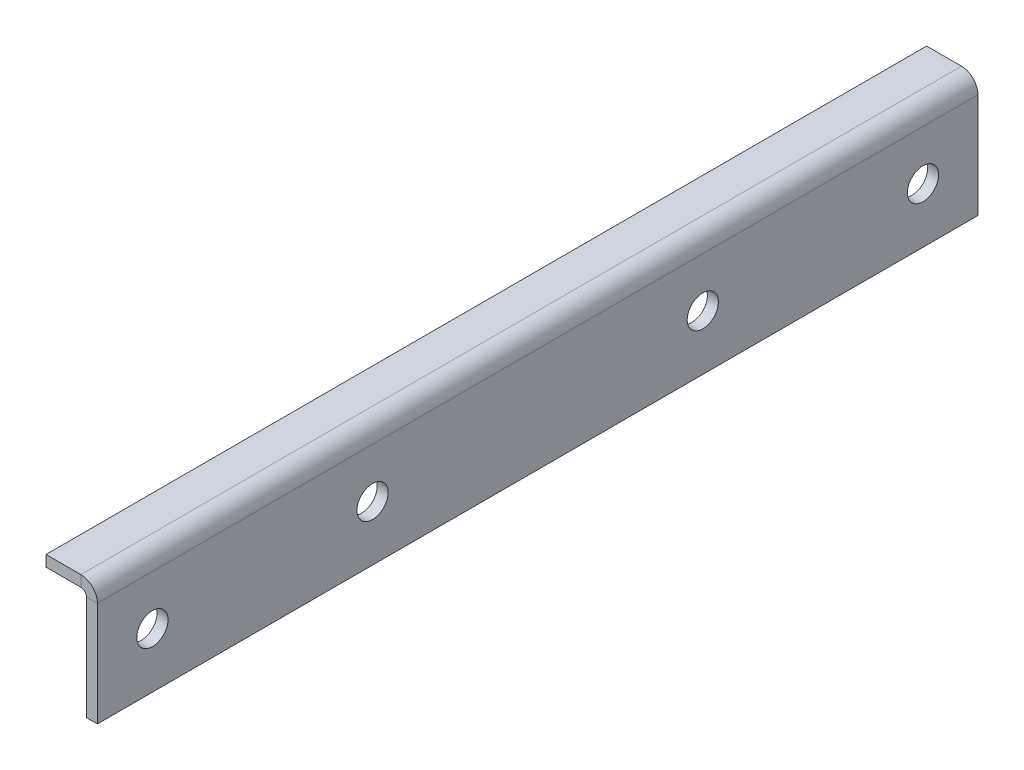
ISO-10303-21;
HEADER;
FILE_DESCRIPTION(('STEP AP214'),'2;1');
FILE_NAME('part.step','',(''),(''),'','','');
FILE_SCHEMA(('AUTOMOTIVE_DESIGN { 1 0 10303 214 1 1 1 1 }'));
ENDSEC;
DATA;
#1=APPLICATION_CONTEXT('core data for automotive mechanical design processes');
#2=APPLICATION_PROTOCOL_DEFINITION('international standard','automotive_design',2000,#1);
#3=PRODUCT_CONTEXT('',#1,'mechanical');
#4=PRODUCT('Part','Part','',(#3));
#5=PRODUCT_RELATED_PRODUCT_CATEGORY('part','',(#4));
#6=PRODUCT_DEFINITION_FORMATION('','',#4);
#7=PRODUCT_DEFINITION_CONTEXT('part definition',#1,'design');
#8=PRODUCT_DEFINITION('design','',#6,#7);
#9=PRODUCT_DEFINITION_SHAPE('','',#8);
#10=(LENGTH_UNIT() NAMED_UNIT(*) SI_UNIT(.MILLI.,.METRE.));
#11=(NAMED_UNIT(*) PLANE_ANGLE_UNIT() SI_UNIT($,.RADIAN.));
#12=(NAMED_UNIT(*) SI_UNIT($,.STERADIAN.) SOLID_ANGLE_UNIT());
#13=UNCERTAINTY_MEASURE_WITH_UNIT(LENGTH_MEASURE(1.E-05),#10,'distance_accuracy_value','');
#14=(GEOMETRIC_REPRESENTATION_CONTEXT(3) GLOBAL_UNCERTAINTY_ASSIGNED_CONTEXT((#13)) GLOBAL_UNIT_ASSIGNED_CONTEXT((#10,
#11,#12)) REPRESENTATION_CONTEXT('',''));
#15=CARTESIAN_POINT('',(0.,0.,0.));
#16=DIRECTION('',(0.,0.,1.));
#17=DIRECTION('',(1.,0.,0.));
#18=AXIS2_PLACEMENT_3D('',#15,#16,#17);
#19=CARTESIAN_POINT('',(3.00000000000005,-30.,-270.149626863363));
#20=DIRECTION('',(1.,0.,0.));
#21=DIRECTION('',(0.,1.,0.));
#22=AXIS2_PLACEMENT_3D('',#19,#20,#21);
#23=PLANE('',#22);
#24=CARTESIAN_POINT('',(3.00000000000002,-15.,-225.));
#25=DIRECTION('',(1.,0.,0.));
#26=DIRECTION('',(0.,1.,0.));
#27=AXIS2_PLACEMENT_3D('',#24,#25,#26);
#28=CIRCLE('',#27,4.25000000000001);
#29=CARTESIAN_POINT('',(3.00000000000002,-10.75,-225.));
#30=VERTEX_POINT('',#29);
#31=EDGE_CURVE('E171',#30,#30,#28,.T.);
#32=ORIENTED_EDGE('',*,*,#31,.F.);
#33=EDGE_LOOP('',(#32));
#34=FACE_BOUND('',#33,.T.);
#35=CARTESIAN_POINT('',(3.00000000000002,-15.,-165.));
#36=DIRECTION('',(1.,0.,0.));
#37=DIRECTION('',(0.,1.,0.));
#38=AXIS2_PLACEMENT_3D('',#35,#36,#37);
#39=CIRCLE('',#38,4.25000000000001);
#40=CARTESIAN_POINT('',(3.00000000000002,-10.75,-165.));
#41=VERTEX_POINT('',#40);
#42=EDGE_CURVE('E177',#41,#41,#39,.T.);
#43=ORIENTED_EDGE('',*,*,#42,.F.);
#44=EDGE_LOOP('',(#43));
#45=FACE_BOUND('',#44,.T.);
#46=CARTESIAN_POINT('',(3.00000000000002,-15.,-74.9999999999998));
#47=DIRECTION('',(1.,0.,0.));
#48=DIRECTION('',(0.,1.,0.));
#49=AXIS2_PLACEMENT_3D('',#46,#47,#48);
#50=CIRCLE('',#49,4.25000000000001);
#51=CARTESIAN_POINT('',(3.00000000000002,-10.75,-74.9999999999998));
#52=VERTEX_POINT('',#51);
#53=EDGE_CURVE('E183',#52,#52,#50,.T.);
#54=ORIENTED_EDGE('',*,*,#53,.F.);
#55=EDGE_LOOP('',(#54));
#56=FACE_BOUND('',#55,.T.);
#57=CARTESIAN_POINT('',(3.00000000000002,-15.,-15.));
#58=DIRECTION('',(1.,0.,0.));
#59=DIRECTION('',(0.,1.,0.));
#60=AXIS2_PLACEMENT_3D('',#57,#58,#59);
#61=CIRCLE('',#60,4.25000000000001);
#62=CARTESIAN_POINT('',(3.00000000000002,-10.75,-15.));
#63=VERTEX_POINT('',#62);
#64=EDGE_CURVE('E165',#63,#63,#61,.T.);
#65=ORIENTED_EDGE('',*,*,#64,.F.);
#66=EDGE_LOOP('',(#65));
#67=FACE_BOUND('',#66,.T.);
#68=DIRECTION('',(0.,1.,0.));
#69=VECTOR('',#68,1.);
#70=CARTESIAN_POINT('',(3.00000000000005,-30.,-240.));
#71=LINE('',#70,#69);
#72=CARTESIAN_POINT('',(3.00000000000005,-30.,-240.));
#73=VERTEX_POINT('',#72);
#74=CARTESIAN_POINT('',(3.00000000000001,-1.50000000000001,-240.));
#75=VERTEX_POINT('',#74);
#76=EDGE_CURVE('E170',#73,#75,#71,.T.);
#77=ORIENTED_EDGE('',*,*,#76,.T.);
#78=DIRECTION('',(0.,0.,-1.));
#79=VECTOR('',#78,1.);
#80=CARTESIAN_POINT('',(3.00000000000001,-1.50000000000001,-240.));
#81=LINE('',#80,#79);
#82=CARTESIAN_POINT('',(3.00000000000002,-1.50000000000001,0.));
#83=VERTEX_POINT('',#82);
#84=EDGE_CURVE('E108',#75,#83,#81,.F.);
#85=ORIENTED_EDGE('',*,*,#84,.T.);
#86=DIRECTION('',(0.,1.,0.));
#87=VECTOR('',#86,1.);
#88=CARTESIAN_POINT('',(3.00000000000005,-30.,0.));
#89=LINE('',#88,#87);
#90=CARTESIAN_POINT('',(3.00000000000005,-30.,0.));
#91=VERTEX_POINT('',#90);
#92=EDGE_CURVE('E198',#91,#83,#89,.T.);
#93=ORIENTED_EDGE('',*,*,#92,.F.);
#94=DIRECTION('',(0.,0.,1.));
#95=VECTOR('',#94,1.);
#96=CARTESIAN_POINT('',(3.00000000000005,-30.,-270.149626863363));
#97=LINE('',#96,#95);
#98=EDGE_CURVE('E11',#73,#91,#97,.T.);
#99=ORIENTED_EDGE('',*,*,#98,.F.);
#100=EDGE_LOOP('',(#77,#85,#93,#99));
#101=FACE_BOUND('',#100,.T.);
#102=ADVANCED_FACE('F38',(#34,#45,#56,#67,#101),#23,.T.);
#103=CARTESIAN_POINT('',(0.,-30.,-270.149626863363));
#104=DIRECTION('',(1.,0.,0.));
#105=DIRECTION('',(0.,1.,0.));
#106=AXIS2_PLACEMENT_3D('',#103,#104,#105);
#107=PLANE('',#106);
#108=CARTESIAN_POINT('',(0.,-15.,-15.));
#109=DIRECTION('',(1.,0.,0.));
#110=DIRECTION('',(0.,1.,0.));
#111=AXIS2_PLACEMENT_3D('',#108,#109,#110);
#112=CIRCLE('',#111,4.25000000000001);
#113=CARTESIAN_POINT('',(0.,-10.75,-15.));
#114=VERTEX_POINT('',#113);
#115=EDGE_CURVE('E186',#114,#114,#112,.T.);
#116=ORIENTED_EDGE('',*,*,#115,.T.);
#117=EDGE_LOOP('',(#116));
#118=FACE_BOUND('',#117,.T.);
#119=CARTESIAN_POINT('',(0.,-15.,-74.9999999999998));
#120=DIRECTION('',(1.,0.,0.));
#121=DIRECTION('',(0.,1.,0.));
#122=AXIS2_PLACEMENT_3D('',#119,#120,#121);
#123=CIRCLE('',#122,4.25000000000001);
#124=CARTESIAN_POINT('',(0.,-10.75,-74.9999999999998));
#125=VERTEX_POINT('',#124);
#126=EDGE_CURVE('E180',#125,#125,#123,.T.);
#127=ORIENTED_EDGE('',*,*,#126,.T.);
#128=EDGE_LOOP('',(#127));
#129=FACE_BOUND('',#128,.T.);
#130=CARTESIAN_POINT('',(0.,-15.,-165.));
#131=DIRECTION('',(1.,0.,0.));
#132=DIRECTION('',(0.,1.,0.));
#133=AXIS2_PLACEMENT_3D('',#130,#131,#132);
#134=CIRCLE('',#133,4.25000000000001);
#135=CARTESIAN_POINT('',(0.,-10.75,-165.));
#136=VERTEX_POINT('',#135);
#137=EDGE_CURVE('E174',#136,#136,#134,.T.);
#138=ORIENTED_EDGE('',*,*,#137,.T.);
#139=EDGE_LOOP('',(#138));
#140=FACE_BOUND('',#139,.T.);
#141=CARTESIAN_POINT('',(0.,-15.,-225.));
#142=DIRECTION('',(1.,0.,0.));
#143=DIRECTION('',(0.,1.,0.));
#144=AXIS2_PLACEMENT_3D('',#141,#142,#143);
#145=CIRCLE('',#144,4.25000000000001);
#146=CARTESIAN_POINT('',(0.,-10.75,-225.));
#147=VERTEX_POINT('',#146);
#148=EDGE_CURVE('E167',#147,#147,#145,.T.);
#149=ORIENTED_EDGE('',*,*,#148,.T.);
#150=EDGE_LOOP('',(#149));
#151=FACE_BOUND('',#150,.T.);
#152=DIRECTION('',(0.,0.,-1.));
#153=VECTOR('',#152,1.);
#154=CARTESIAN_POINT('',(0.,-1.49999999999999,-240.));
#155=LINE('',#154,#153);
#156=CARTESIAN_POINT('',(0.,-1.49999999999999,-240.));
#157=VERTEX_POINT('',#156);
#158=CARTESIAN_POINT('',(0.,-1.50000000000001,0.));
#159=VERTEX_POINT('',#158);
#160=EDGE_CURVE('E159',#157,#159,#155,.F.);
#161=ORIENTED_EDGE('',*,*,#160,.F.);
#162=DIRECTION('',(0.,1.,0.));
#163=VECTOR('',#162,1.);
#164=CARTESIAN_POINT('',(0.,-30.,-240.));
#165=LINE('',#164,#163);
#166=CARTESIAN_POINT('',(0.,-30.,-240.));
#167=VERTEX_POINT('',#166);
#168=EDGE_CURVE('E191',#167,#157,#165,.T.);
#169=ORIENTED_EDGE('',*,*,#168,.F.);
#170=DIRECTION('',(0.,0.,1.));
#171=VECTOR('',#170,1.);
#172=CARTESIAN_POINT('',(0.,-30.,-270.149626863363));
#173=LINE('',#172,#171);
#174=CARTESIAN_POINT('',(0.,-30.,0.));
#175=VERTEX_POINT('',#174);
#176=EDGE_CURVE('E41',#167,#175,#173,.T.);
#177=ORIENTED_EDGE('',*,*,#176,.T.);
#178=DIRECTION('',(0.,1.,0.));
#179=VECTOR('',#178,1.);
#180=CARTESIAN_POINT('',(0.,-30.,0.));
#181=LINE('',#180,#179);
#182=EDGE_CURVE('E201',#175,#159,#181,.T.);
#183=ORIENTED_EDGE('',*,*,#182,.T.);
#184=EDGE_LOOP('',(#161,#169,#177,#183));
#185=FACE_BOUND('',#184,.T.);
#186=ADVANCED_FACE('F211',(#118,#129,#140,#151,#185),#107,.F.);
#187=CARTESIAN_POINT('',(0.,0.,0.));
#188=DIRECTION('',(0.,0.,-1.));
#189=DIRECTION('',(-1.,0.,0.));
#190=AXIS2_PLACEMENT_3D('',#187,#188,#189);
#191=PLANE('',#190);
#192=DIRECTION('',(1.,0.,0.));
#193=VECTOR('',#192,1.);
#194=CARTESIAN_POINT('',(0.,-1.50000000000001,0.));
#195=LINE('',#194,#193);
#196=EDGE_CURVE('E162',#159,#83,#195,.T.);
#197=ORIENTED_EDGE('',*,*,#196,.F.);
#198=ORIENTED_EDGE('',*,*,#182,.F.);
#199=DIRECTION('',(-1.,0.,0.));
#200=VECTOR('',#199,1.);
#201=CARTESIAN_POINT('',(3.00000000000005,-30.,0.));
#202=LINE('',#201,#200);
#203=EDGE_CURVE('E203',#91,#175,#202,.T.);
#204=ORIENTED_EDGE('',*,*,#203,.F.);
#205=ORIENTED_EDGE('',*,*,#92,.T.);
#206=EDGE_LOOP('',(#197,#198,#204,#205));
#207=FACE_BOUND('',#206,.T.);
#208=ADVANCED_FACE('F209',(#207),#191,.F.);
#209=CARTESIAN_POINT('',(3.00000000000005,-30.,-240.));
#210=DIRECTION('',(0.,0.,-1.));
#211=DIRECTION('',(0.,1.,0.));
#212=AXIS2_PLACEMENT_3D('',#209,#210,#211);
#213=PLANE('',#212);
#214=ORIENTED_EDGE('',*,*,#168,.T.);
#215=DIRECTION('',(1.,0.,0.));
#216=VECTOR('',#215,1.);
#217=CARTESIAN_POINT('',(0.,-1.49999999999999,-240.));
#218=LINE('',#217,#216);
#219=EDGE_CURVE('E155',#157,#75,#218,.T.);
#220=ORIENTED_EDGE('',*,*,#219,.T.);
#221=ORIENTED_EDGE('',*,*,#76,.F.);
#222=DIRECTION('',(1.,0.,0.));
#223=VECTOR('',#222,1.);
#224=CARTESIAN_POINT('',(3.00000000000005,-30.,-240.));
#225=LINE('',#224,#223);
#226=EDGE_CURVE('E194',#73,#167,#225,.F.);
#227=ORIENTED_EDGE('',*,*,#226,.T.);
#228=EDGE_LOOP('',(#214,#220,#221,#227));
#229=FACE_BOUND('',#228,.T.);
#230=ADVANCED_FACE('F215',(#229),#213,.T.);
#231=CARTESIAN_POINT('',(3.00000000000005,-30.,-270.149626863363));
#232=DIRECTION('',(0.,1.,0.));
#233=DIRECTION('',(-1.,0.,0.));
#234=AXIS2_PLACEMENT_3D('',#231,#232,#233);
#235=PLANE('',#234);
#236=ORIENTED_EDGE('',*,*,#226,.F.);
#237=ORIENTED_EDGE('',*,*,#98,.T.);
#238=ORIENTED_EDGE('',*,*,#203,.T.);
#239=ORIENTED_EDGE('',*,*,#176,.F.);
#240=EDGE_LOOP('',(#236,#237,#238,#239));
#241=FACE_BOUND('',#240,.T.);
#242=ADVANCED_FACE('F205',(#241),#235,.F.);
#243=CARTESIAN_POINT('',(0.,-15.,-15.));
#244=DIRECTION('',(1.,0.,0.));
#245=DIRECTION('',(0.,1.,0.));
#246=AXIS2_PLACEMENT_3D('',#243,#244,#245);
#247=CYLINDRICAL_SURFACE('',#246,4.25000000000001);
#248=ORIENTED_EDGE('',*,*,#115,.F.);
#249=EDGE_LOOP('',(#248));
#250=FACE_BOUND('',#249,.T.);
#251=ORIENTED_EDGE('',*,*,#64,.T.);
#252=EDGE_LOOP('',(#251));
#253=FACE_BOUND('',#252,.T.);
#254=ADVANCED_FACE('F231',(#250,#253),#247,.F.);
#255=CARTESIAN_POINT('',(0.,-15.,-74.9999999999998));
#256=DIRECTION('',(1.,0.,0.));
#257=DIRECTION('',(0.,1.,0.));
#258=AXIS2_PLACEMENT_3D('',#255,#256,#257);
#259=CYLINDRICAL_SURFACE('',#258,4.25000000000001);
#260=ORIENTED_EDGE('',*,*,#126,.F.);
#261=EDGE_LOOP('',(#260));
#262=FACE_BOUND('',#261,.T.);
#263=ORIENTED_EDGE('',*,*,#53,.T.);
#264=EDGE_LOOP('',(#263));
#265=FACE_BOUND('',#264,.T.);
#266=ADVANCED_FACE('F233',(#262,#265),#259,.F.);
#267=CARTESIAN_POINT('',(0.,-15.,-165.));
#268=DIRECTION('',(1.,0.,0.));
#269=DIRECTION('',(0.,1.,0.));
#270=AXIS2_PLACEMENT_3D('',#267,#268,#269);
#271=CYLINDRICAL_SURFACE('',#270,4.25000000000001);
#272=ORIENTED_EDGE('',*,*,#137,.F.);
#273=EDGE_LOOP('',(#272));
#274=FACE_BOUND('',#273,.T.);
#275=ORIENTED_EDGE('',*,*,#42,.T.);
#276=EDGE_LOOP('',(#275));
#277=FACE_BOUND('',#276,.T.);
#278=ADVANCED_FACE('F240',(#274,#277),#271,.F.);
#279=CARTESIAN_POINT('',(0.,-15.,-225.));
#280=DIRECTION('',(1.,0.,0.));
#281=DIRECTION('',(0.,1.,0.));
#282=AXIS2_PLACEMENT_3D('',#279,#280,#281);
#283=CYLINDRICAL_SURFACE('',#282,4.25000000000001);
#284=ORIENTED_EDGE('',*,*,#148,.F.);
#285=EDGE_LOOP('',(#284));
#286=FACE_BOUND('',#285,.T.);
#287=ORIENTED_EDGE('',*,*,#31,.T.);
#288=EDGE_LOOP('',(#287));
#289=FACE_BOUND('',#288,.T.);
#290=ADVANCED_FACE('F285',(#286,#289),#283,.F.);
#291=CARTESIAN_POINT('',(-1.5,-1.5,0.));
#292=DIRECTION('',(0.,0.,1.));
#293=DIRECTION('',(0.,-1.,0.));
#294=AXIS2_PLACEMENT_3D('',#291,#292,#293);
#295=PLANE('',#294);
#296=DIRECTION('',(0.,1.,0.));
#297=VECTOR('',#296,1.);
#298=CARTESIAN_POINT('',(-1.49999999999999,0.,0.));
#299=LINE('',#298,#297);
#300=CARTESIAN_POINT('',(-1.49999999999999,0.,0.));
#301=VERTEX_POINT('',#300);
#302=CARTESIAN_POINT('',(-1.49999999999999,3.,0.));
#303=VERTEX_POINT('',#302);
#304=EDGE_CURVE('E428',#301,#303,#299,.T.);
#305=ORIENTED_EDGE('',*,*,#304,.F.);
#306=CARTESIAN_POINT('',(-1.5,-1.5,0.));
#307=DIRECTION('',(0.,0.,-1.));
#308=DIRECTION('',(0.,1.,0.));
#309=AXIS2_PLACEMENT_3D('',#306,#307,#308);
#310=CIRCLE('',#309,1.50000000000001);
#311=EDGE_CURVE('E111',#159,#301,#310,.F.);
#312=ORIENTED_EDGE('',*,*,#311,.F.);
#313=ORIENTED_EDGE('',*,*,#196,.T.);
#314=CARTESIAN_POINT('',(-1.5,-1.5,0.));
#315=DIRECTION('',(0.,0.,-1.));
#316=DIRECTION('',(0.,1.,0.));
#317=AXIS2_PLACEMENT_3D('',#314,#315,#316);
#318=CIRCLE('',#317,4.50000000000001);
#319=EDGE_CURVE('E154',#83,#303,#318,.F.);
#320=ORIENTED_EDGE('',*,*,#319,.T.);
#321=EDGE_LOOP('',(#305,#312,#313,#320));
#322=FACE_BOUND('',#321,.T.);
#323=ADVANCED_FACE('F294',(#322),#295,.T.);
#324=CARTESIAN_POINT('',(-1.5,-1.49999999999999,-240.));
#325=DIRECTION('',(0.,0.,1.));
#326=DIRECTION('',(0.,-1.,0.));
#327=AXIS2_PLACEMENT_3D('',#324,#325,#326);
#328=PLANE('',#327);
#329=CARTESIAN_POINT('',(-1.5,-1.49999999999999,-240.));
#330=DIRECTION('',(0.,0.,-1.));
#331=DIRECTION('',(0.,1.,0.));
#332=AXIS2_PLACEMENT_3D('',#329,#330,#331);
#333=CIRCLE('',#332,1.50000000000001);
#334=CARTESIAN_POINT('',(-1.49999999999999,0.,-240.));
#335=VERTEX_POINT('',#334);
#336=EDGE_CURVE('E118',#335,#157,#333,.T.);
#337=ORIENTED_EDGE('',*,*,#336,.F.);
#338=DIRECTION('',(0.,1.,0.));
#339=VECTOR('',#338,1.);
#340=CARTESIAN_POINT('',(-1.49999999999999,0.,-240.));
#341=LINE('',#340,#339);
#342=CARTESIAN_POINT('',(-1.49999999999999,3.,-240.));
#343=VERTEX_POINT('',#342);
#344=EDGE_CURVE('E115',#335,#343,#341,.T.);
#345=ORIENTED_EDGE('',*,*,#344,.T.);
#346=CARTESIAN_POINT('',(-1.5,-1.49999999999999,-240.));
#347=DIRECTION('',(0.,0.,-1.));
#348=DIRECTION('',(0.,1.,0.));
#349=AXIS2_PLACEMENT_3D('',#346,#347,#348);
#350=CIRCLE('',#349,4.50000000000001);
#351=EDGE_CURVE('E101',#343,#75,#350,.T.);
#352=ORIENTED_EDGE('',*,*,#351,.T.);
#353=ORIENTED_EDGE('',*,*,#219,.F.);
#354=EDGE_LOOP('',(#337,#345,#352,#353));
#355=FACE_BOUND('',#354,.T.);
#356=ADVANCED_FACE('F116',(#355),#328,.F.);
#357=CARTESIAN_POINT('',(-1.5,-1.49999999999999,-240.));
#358=DIRECTION('',(0.,0.,-1.));
#359=DIRECTION('',(0.,1.,0.));
#360=AXIS2_PLACEMENT_3D('',#357,#358,#359);
#361=CYLINDRICAL_SURFACE('',#360,4.50000000000001);
#362=ORIENTED_EDGE('',*,*,#84,.F.);
#363=ORIENTED_EDGE('',*,*,#351,.F.);
#364=DIRECTION('',(0.,0.,1.));
#365=VECTOR('',#364,1.);
#366=CARTESIAN_POINT('',(-1.49999999999999,3.,0.));
#367=LINE('',#366,#365);
#368=EDGE_CURVE('E105',#343,#303,#367,.T.);
#369=ORIENTED_EDGE('',*,*,#368,.T.);
#370=ORIENTED_EDGE('',*,*,#319,.F.);
#371=EDGE_LOOP('',(#362,#363,#369,#370));
#372=FACE_BOUND('',#371,.T.);
#373=ADVANCED_FACE('F103',(#372),#361,.T.);
#374=CARTESIAN_POINT('',(-1.5,-1.49999999999999,-240.));
#375=DIRECTION('',(0.,0.,-1.));
#376=DIRECTION('',(0.,1.,0.));
#377=AXIS2_PLACEMENT_3D('',#374,#375,#376);
#378=CYLINDRICAL_SURFACE('',#377,1.50000000000001);
#379=ORIENTED_EDGE('',*,*,#160,.T.);
#380=ORIENTED_EDGE('',*,*,#311,.T.);
#381=DIRECTION('',(0.,0.,-1.));
#382=VECTOR('',#381,1.);
#383=CARTESIAN_POINT('',(-1.49999999999999,0.,0.));
#384=LINE('',#383,#382);
#385=EDGE_CURVE('E122',#301,#335,#384,.T.);
#386=ORIENTED_EDGE('',*,*,#385,.T.);
#387=ORIENTED_EDGE('',*,*,#336,.T.);
#388=EDGE_LOOP('',(#379,#380,#386,#387));
#389=FACE_BOUND('',#388,.T.);
#390=ADVANCED_FACE('F351',(#389),#378,.F.);
#391=CARTESIAN_POINT('',(-11.,3.00000000000002,-240.));
#392=DIRECTION('',(0.,0.,1.));
#393=DIRECTION('',(1.,0.,0.));
#394=AXIS2_PLACEMENT_3D('',#391,#392,#393);
#395=PLANE('',#394);
#396=ORIENTED_EDGE('',*,*,#344,.F.);
#397=DIRECTION('',(-1.,0.,0.));
#398=VECTOR('',#397,1.);
#399=CARTESIAN_POINT('',(-11.,0.,-240.));
#400=LINE('',#399,#398);
#401=CARTESIAN_POINT('',(-11.,0.,-240.));
#402=VERTEX_POINT('',#401);
#403=EDGE_CURVE('E131',#335,#402,#400,.T.);
#404=ORIENTED_EDGE('',*,*,#403,.T.);
#405=DIRECTION('',(0.,-1.,0.));
#406=VECTOR('',#405,1.);
#407=CARTESIAN_POINT('',(-11.,3.00000000000002,-240.));
#408=LINE('',#407,#406);
#409=CARTESIAN_POINT('',(-11.,3.00000000000002,-240.));
#410=VERTEX_POINT('',#409);
#411=EDGE_CURVE('E136',#410,#402,#408,.T.);
#412=ORIENTED_EDGE('',*,*,#411,.F.);
#413=DIRECTION('',(-1.,0.,0.));
#414=VECTOR('',#413,1.);
#415=CARTESIAN_POINT('',(-11.,3.00000000000002,-240.));
#416=LINE('',#415,#414);
#417=EDGE_CURVE('E127',#343,#410,#416,.T.);
#418=ORIENTED_EDGE('',*,*,#417,.F.);
#419=EDGE_LOOP('',(#396,#404,#412,#418));
#420=FACE_BOUND('',#419,.T.);
#421=ADVANCED_FACE('F134',(#420),#395,.F.);
#422=CARTESIAN_POINT('',(0.,3.,0.));
#423=DIRECTION('',(0.,0.,-1.));
#424=DIRECTION('',(-1.,0.,0.));
#425=AXIS2_PLACEMENT_3D('',#422,#423,#424);
#426=PLANE('',#425);
#427=ORIENTED_EDGE('',*,*,#304,.T.);
#428=DIRECTION('',(1.,0.,0.));
#429=VECTOR('',#428,1.);
#430=CARTESIAN_POINT('',(0.,3.,0.));
#431=LINE('',#430,#429);
#432=CARTESIAN_POINT('',(-11.,3.00000000000002,0.));
#433=VERTEX_POINT('',#432);
#434=EDGE_CURVE('E130',#433,#303,#431,.T.);
#435=ORIENTED_EDGE('',*,*,#434,.F.);
#436=DIRECTION('',(0.,-1.,0.));
#437=VECTOR('',#436,1.);
#438=CARTESIAN_POINT('',(-11.,3.00000000000002,0.));
#439=LINE('',#438,#437);
#440=CARTESIAN_POINT('',(-11.,0.,0.));
#441=VERTEX_POINT('',#440);
#442=EDGE_CURVE('E147',#433,#441,#439,.T.);
#443=ORIENTED_EDGE('',*,*,#442,.T.);
#444=DIRECTION('',(1.,0.,0.));
#445=VECTOR('',#444,1.);
#446=CARTESIAN_POINT('',(0.,0.,0.));
#447=LINE('',#446,#445);
#448=EDGE_CURVE('E138',#441,#301,#447,.T.);
#449=ORIENTED_EDGE('',*,*,#448,.T.);
#450=EDGE_LOOP('',(#427,#435,#443,#449));
#451=FACE_BOUND('',#450,.T.);
#452=ADVANCED_FACE('F370',(#451),#426,.F.);
#453=CARTESIAN_POINT('',(0.,3.,0.));
#454=DIRECTION('',(0.,-1.,0.));
#455=DIRECTION('',(1.,0.,0.));
#456=AXIS2_PLACEMENT_3D('',#453,#454,#455);
#457=PLANE('',#456);
#458=ORIENTED_EDGE('',*,*,#368,.F.);
#459=ORIENTED_EDGE('',*,*,#417,.T.);
#460=DIRECTION('',(0.,0.,1.));
#461=VECTOR('',#460,1.);
#462=CARTESIAN_POINT('',(-11.,3.00000000000002,0.));
#463=LINE('',#462,#461);
#464=EDGE_CURVE('E137',#410,#433,#463,.T.);
#465=ORIENTED_EDGE('',*,*,#464,.T.);
#466=ORIENTED_EDGE('',*,*,#434,.T.);
#467=EDGE_LOOP('',(#458,#459,#465,#466));
#468=FACE_BOUND('',#467,.T.);
#469=ADVANCED_FACE('F126',(#468),#457,.F.);
#470=CARTESIAN_POINT('',(0.,0.,0.));
#471=DIRECTION('',(0.,-1.,0.));
#472=DIRECTION('',(1.,0.,0.));
#473=AXIS2_PLACEMENT_3D('',#470,#471,#472);
#474=PLANE('',#473);
#475=ORIENTED_EDGE('',*,*,#403,.F.);
#476=ORIENTED_EDGE('',*,*,#385,.F.);
#477=ORIENTED_EDGE('',*,*,#448,.F.);
#478=DIRECTION('',(0.,0.,1.));
#479=VECTOR('',#478,1.);
#480=CARTESIAN_POINT('',(-11.,0.,0.));
#481=LINE('',#480,#479);
#482=EDGE_CURVE('E142',#402,#441,#481,.T.);
#483=ORIENTED_EDGE('',*,*,#482,.F.);
#484=EDGE_LOOP('',(#475,#476,#477,#483));
#485=FACE_BOUND('',#484,.T.);
#486=ADVANCED_FACE('F390',(#485),#474,.T.);
#487=CARTESIAN_POINT('',(-11.,3.00000000000002,0.));
#488=DIRECTION('',(1.,0.,0.));
#489=DIRECTION('',(0.,1.,0.));
#490=AXIS2_PLACEMENT_3D('',#487,#488,#489);
#491=PLANE('',#490);
#492=ORIENTED_EDGE('',*,*,#482,.T.);
#493=ORIENTED_EDGE('',*,*,#442,.F.);
#494=ORIENTED_EDGE('',*,*,#464,.F.);
#495=ORIENTED_EDGE('',*,*,#411,.T.);
#496=EDGE_LOOP('',(#492,#493,#494,#495));
#497=FACE_BOUND('',#496,.T.);
#498=ADVANCED_FACE('F400',(#497),#491,.F.);
#499=CLOSED_SHELL('',(#102,#186,#208,#230,#242,#254,#266,#278,#290,#323,#356,#373,#390,#421,
#452,#469,#486,#498));
#500=MANIFOLD_SOLID_BREP('B2',#499);
#501=ADVANCED_BREP_SHAPE_REPRESENTATION('',(#18,#500),#14);
#502=SHAPE_DEFINITION_REPRESENTATION(#9,#501);
ENDSEC;
END-ISO-10303-21;
